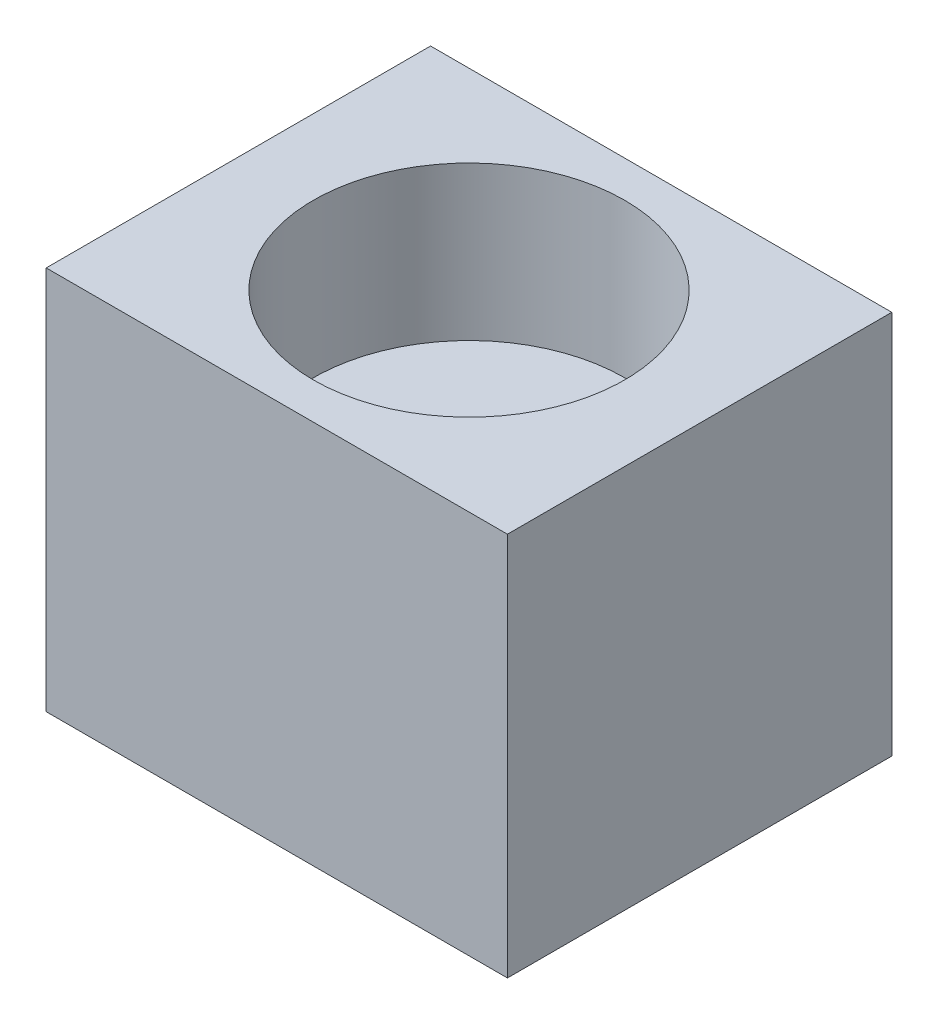
ISO-10303-21;
HEADER;
FILE_DESCRIPTION(('STEP AP214'),'2;1');
FILE_NAME('part.step','',(''),(''),'','','');
FILE_SCHEMA(('AUTOMOTIVE_DESIGN { 1 0 10303 214 1 1 1 1 }'));
ENDSEC;
DATA;
#1=APPLICATION_CONTEXT('core data for automotive mechanical design processes');
#2=APPLICATION_PROTOCOL_DEFINITION('international standard','automotive_design',2000,#1);
#3=PRODUCT_CONTEXT('',#1,'mechanical');
#4=PRODUCT('Part','Part','',(#3));
#5=PRODUCT_RELATED_PRODUCT_CATEGORY('part','',(#4));
#6=PRODUCT_DEFINITION_FORMATION('','',#4);
#7=PRODUCT_DEFINITION_CONTEXT('part definition',#1,'design');
#8=PRODUCT_DEFINITION('design','',#6,#7);
#9=PRODUCT_DEFINITION_SHAPE('','',#8);
#10=(LENGTH_UNIT() NAMED_UNIT(*) SI_UNIT(.MILLI.,.METRE.));
#11=(NAMED_UNIT(*) PLANE_ANGLE_UNIT() SI_UNIT($,.RADIAN.));
#12=(NAMED_UNIT(*) SI_UNIT($,.STERADIAN.) SOLID_ANGLE_UNIT());
#13=UNCERTAINTY_MEASURE_WITH_UNIT(LENGTH_MEASURE(1.E-05),#10,'distance_accuracy_value','');
#14=(GEOMETRIC_REPRESENTATION_CONTEXT(3) GLOBAL_UNCERTAINTY_ASSIGNED_CONTEXT((#13)) GLOBAL_UNIT_ASSIGNED_CONTEXT((#10,
#11,#12)) REPRESENTATION_CONTEXT('',''));
#15=CARTESIAN_POINT('',(0.,0.,0.));
#16=DIRECTION('',(0.,0.,1.));
#17=DIRECTION('',(1.,0.,0.));
#18=AXIS2_PLACEMENT_3D('',#15,#16,#17);
#19=CARTESIAN_POINT('',(30.,50.,25.));
#20=DIRECTION('',(-1.,0.,0.));
#21=DIRECTION('',(0.,0.,1.));
#22=AXIS2_PLACEMENT_3D('',#19,#20,#21);
#23=PLANE('',#22);
#24=DIRECTION('',(0.,0.,-1.));
#25=VECTOR('',#24,1.);
#26=CARTESIAN_POINT('',(30.,0.,25.));
#27=LINE('',#26,#25);
#28=CARTESIAN_POINT('',(30.,0.,25.));
#29=VERTEX_POINT('',#28);
#30=CARTESIAN_POINT('',(30.,0.,-25.));
#31=VERTEX_POINT('',#30);
#32=EDGE_CURVE('E107',#29,#31,#27,.T.);
#33=ORIENTED_EDGE('',*,*,#32,.T.);
#34=DIRECTION('',(0.,-1.,0.));
#35=VECTOR('',#34,1.);
#36=CARTESIAN_POINT('',(30.,50.,-25.));
#37=LINE('',#36,#35);
#38=CARTESIAN_POINT('',(30.,50.,-25.));
#39=VERTEX_POINT('',#38);
#40=EDGE_CURVE('E11',#39,#31,#37,.T.);
#41=ORIENTED_EDGE('',*,*,#40,.F.);
#42=DIRECTION('',(0.,0.,-1.));
#43=VECTOR('',#42,1.);
#44=CARTESIAN_POINT('',(30.,50.,25.));
#45=LINE('',#44,#43);
#46=CARTESIAN_POINT('',(30.,50.,25.));
#47=VERTEX_POINT('',#46);
#48=EDGE_CURVE('E91',#47,#39,#45,.T.);
#49=ORIENTED_EDGE('',*,*,#48,.F.);
#50=DIRECTION('',(0.,-1.,0.));
#51=VECTOR('',#50,1.);
#52=CARTESIAN_POINT('',(30.,50.,25.));
#53=LINE('',#52,#51);
#54=EDGE_CURVE('E103',#47,#29,#53,.T.);
#55=ORIENTED_EDGE('',*,*,#54,.T.);
#56=EDGE_LOOP('',(#33,#41,#49,#55));
#57=FACE_BOUND('',#56,.T.);
#58=ADVANCED_FACE('F39',(#57),#23,.F.);
#59=CARTESIAN_POINT('',(-30.,50.,-25.));
#60=DIRECTION('',(0.,0.,1.));
#61=DIRECTION('',(1.,0.,0.));
#62=AXIS2_PLACEMENT_3D('',#59,#60,#61);
#63=PLANE('',#62);
#64=DIRECTION('',(-1.,0.,0.));
#65=VECTOR('',#64,1.);
#66=CARTESIAN_POINT('',(-30.,0.,-25.));
#67=LINE('',#66,#65);
#68=CARTESIAN_POINT('',(-30.,0.,-25.));
#69=VERTEX_POINT('',#68);
#70=EDGE_CURVE('E96',#31,#69,#67,.T.);
#71=ORIENTED_EDGE('',*,*,#70,.T.);
#72=DIRECTION('',(0.,-1.,0.));
#73=VECTOR('',#72,1.);
#74=CARTESIAN_POINT('',(-30.,50.,-25.));
#75=LINE('',#74,#73);
#76=CARTESIAN_POINT('',(-30.,50.,-25.));
#77=VERTEX_POINT('',#76);
#78=EDGE_CURVE('E48',#77,#69,#75,.T.);
#79=ORIENTED_EDGE('',*,*,#78,.F.);
#80=DIRECTION('',(-1.,0.,0.));
#81=VECTOR('',#80,1.);
#82=CARTESIAN_POINT('',(-30.,50.,-25.));
#83=LINE('',#82,#81);
#84=EDGE_CURVE('E86',#39,#77,#83,.T.);
#85=ORIENTED_EDGE('',*,*,#84,.F.);
#86=ORIENTED_EDGE('',*,*,#40,.T.);
#87=EDGE_LOOP('',(#71,#79,#85,#86));
#88=FACE_BOUND('',#87,.T.);
#89=ADVANCED_FACE('F95',(#88),#63,.F.);
#90=CARTESIAN_POINT('',(-30.,50.,25.));
#91=DIRECTION('',(1.,0.,0.));
#92=DIRECTION('',(0.,0.,-1.));
#93=AXIS2_PLACEMENT_3D('',#90,#91,#92);
#94=PLANE('',#93);
#95=DIRECTION('',(0.,0.,1.));
#96=VECTOR('',#95,1.);
#97=CARTESIAN_POINT('',(-30.,0.,25.));
#98=LINE('',#97,#96);
#99=CARTESIAN_POINT('',(-30.,0.,25.));
#100=VERTEX_POINT('',#99);
#101=EDGE_CURVE('E73',#69,#100,#98,.T.);
#102=ORIENTED_EDGE('',*,*,#101,.T.);
#103=DIRECTION('',(0.,-1.,0.));
#104=VECTOR('',#103,1.);
#105=CARTESIAN_POINT('',(-30.,50.,25.));
#106=LINE('',#105,#104);
#107=CARTESIAN_POINT('',(-30.,50.,25.));
#108=VERTEX_POINT('',#107);
#109=EDGE_CURVE('E98',#108,#100,#106,.T.);
#110=ORIENTED_EDGE('',*,*,#109,.F.);
#111=DIRECTION('',(0.,0.,1.));
#112=VECTOR('',#111,1.);
#113=CARTESIAN_POINT('',(-30.,50.,25.));
#114=LINE('',#113,#112);
#115=EDGE_CURVE('E89',#77,#108,#114,.T.);
#116=ORIENTED_EDGE('',*,*,#115,.F.);
#117=ORIENTED_EDGE('',*,*,#78,.T.);
#118=EDGE_LOOP('',(#102,#110,#116,#117));
#119=FACE_BOUND('',#118,.T.);
#120=ADVANCED_FACE('F99',(#119),#94,.F.);
#121=CARTESIAN_POINT('',(-30.,50.,25.));
#122=DIRECTION('',(0.,0.,-1.));
#123=DIRECTION('',(-1.,0.,0.));
#124=AXIS2_PLACEMENT_3D('',#121,#122,#123);
#125=PLANE('',#124);
#126=DIRECTION('',(1.,0.,0.));
#127=VECTOR('',#126,1.);
#128=CARTESIAN_POINT('',(-30.,0.,25.));
#129=LINE('',#128,#127);
#130=EDGE_CURVE('E79',#100,#29,#129,.T.);
#131=ORIENTED_EDGE('',*,*,#130,.T.);
#132=ORIENTED_EDGE('',*,*,#54,.F.);
#133=DIRECTION('',(1.,0.,0.));
#134=VECTOR('',#133,1.);
#135=CARTESIAN_POINT('',(-30.,50.,25.));
#136=LINE('',#135,#134);
#137=EDGE_CURVE('E56',#108,#47,#136,.T.);
#138=ORIENTED_EDGE('',*,*,#137,.F.);
#139=ORIENTED_EDGE('',*,*,#109,.T.);
#140=EDGE_LOOP('',(#131,#132,#138,#139));
#141=FACE_BOUND('',#140,.T.);
#142=ADVANCED_FACE('F121',(#141),#125,.F.);
#143=CARTESIAN_POINT('',(0.,50.,0.));
#144=DIRECTION('',(0.,-1.,0.));
#145=DIRECTION('',(0.,0.,-1.));
#146=AXIS2_PLACEMENT_3D('',#143,#144,#145);
#147=PLANE('',#146);
#148=CARTESIAN_POINT('',(0.,50.,0.));
#149=DIRECTION('',(0.,1.,0.));
#150=DIRECTION('',(0.,0.,1.));
#151=AXIS2_PLACEMENT_3D('',#148,#149,#150);
#152=CIRCLE('',#151,20.25);
#153=CARTESIAN_POINT('',(0.,50.,20.25));
#154=VERTEX_POINT('',#153);
#155=EDGE_CURVE('E128',#154,#154,#152,.T.);
#156=ORIENTED_EDGE('',*,*,#155,.F.);
#157=EDGE_LOOP('',(#156));
#158=FACE_BOUND('',#157,.T.);
#159=ORIENTED_EDGE('',*,*,#48,.T.);
#160=ORIENTED_EDGE('',*,*,#84,.T.);
#161=ORIENTED_EDGE('',*,*,#115,.T.);
#162=ORIENTED_EDGE('',*,*,#137,.T.);
#163=EDGE_LOOP('',(#159,#160,#161,#162));
#164=FACE_BOUND('',#163,.T.);
#165=ADVANCED_FACE('F87',(#158,#164),#147,.F.);
#166=CARTESIAN_POINT('',(0.,0.,0.));
#167=DIRECTION('',(0.,-1.,0.));
#168=DIRECTION('',(0.,0.,-1.));
#169=AXIS2_PLACEMENT_3D('',#166,#167,#168);
#170=PLANE('',#169);
#171=ORIENTED_EDGE('',*,*,#32,.F.);
#172=ORIENTED_EDGE('',*,*,#130,.F.);
#173=ORIENTED_EDGE('',*,*,#101,.F.);
#174=ORIENTED_EDGE('',*,*,#70,.F.);
#175=EDGE_LOOP('',(#171,#172,#173,#174));
#176=FACE_BOUND('',#175,.T.);
#177=ADVANCED_FACE('F124',(#176),#170,.T.);
#178=CARTESIAN_POINT('',(0.,30.,0.));
#179=DIRECTION('',(0.,1.,0.));
#180=DIRECTION('',(0.,0.,1.));
#181=AXIS2_PLACEMENT_3D('',#178,#179,#180);
#182=CYLINDRICAL_SURFACE('',#181,20.25);
#183=CARTESIAN_POINT('',(0.,30.,0.));
#184=DIRECTION('',(0.,1.,0.));
#185=DIRECTION('',(0.,0.,1.));
#186=AXIS2_PLACEMENT_3D('',#183,#184,#185);
#187=CIRCLE('',#186,20.25);
#188=CARTESIAN_POINT('',(0.,30.,20.25));
#189=VERTEX_POINT('',#188);
#190=EDGE_CURVE('E111',#189,#189,#187,.T.);
#191=ORIENTED_EDGE('',*,*,#190,.F.);
#192=EDGE_LOOP('',(#191));
#193=FACE_BOUND('',#192,.T.);
#194=ORIENTED_EDGE('',*,*,#155,.T.);
#195=EDGE_LOOP('',(#194));
#196=FACE_BOUND('',#195,.T.);
#197=ADVANCED_FACE('F138',(#193,#196),#182,.F.);
#198=CARTESIAN_POINT('',(0.,30.,0.));
#199=DIRECTION('',(0.,1.,0.));
#200=DIRECTION('',(0.,0.,1.));
#201=AXIS2_PLACEMENT_3D('',#198,#199,#200);
#202=PLANE('',#201);
#203=ORIENTED_EDGE('',*,*,#190,.T.);
#204=EDGE_LOOP('',(#203));
#205=FACE_BOUND('',#204,.T.);
#206=ADVANCED_FACE('F136',(#205),#202,.T.);
#207=CLOSED_SHELL('',(#58,#89,#120,#142,#165,#177,#197,#206));
#208=MANIFOLD_SOLID_BREP('B2',#207);
#209=ADVANCED_BREP_SHAPE_REPRESENTATION('',(#18,#208),#14);
#210=SHAPE_DEFINITION_REPRESENTATION(#9,#209);
ENDSEC;
END-ISO-10303-21;
